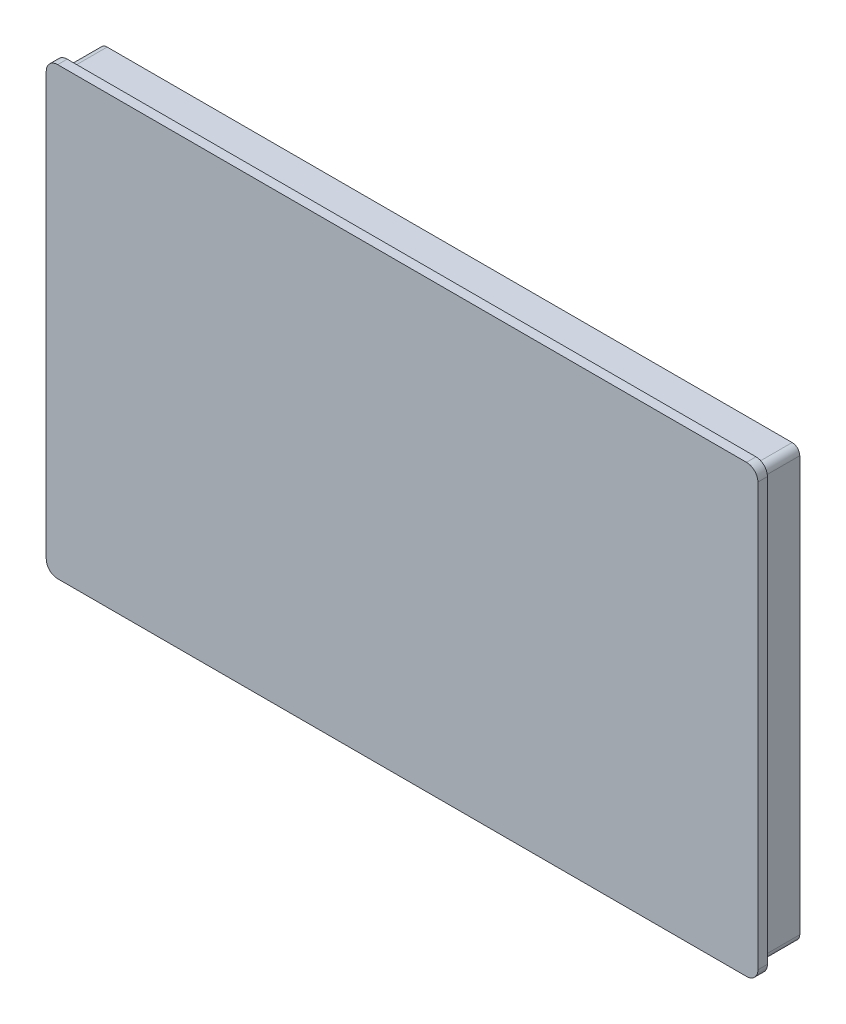
ISO-10303-21;
HEADER;
FILE_DESCRIPTION(('STEP AP214'),'2;1');
FILE_NAME('part.step','',(''),(''),'','','');
FILE_SCHEMA(('AUTOMOTIVE_DESIGN { 1 0 10303 214 1 1 1 1 }'));
ENDSEC;
DATA;
#1=APPLICATION_CONTEXT('core data for automotive mechanical design processes');
#2=APPLICATION_PROTOCOL_DEFINITION('international standard','automotive_design',2000,#1);
#3=PRODUCT_CONTEXT('',#1,'mechanical');
#4=PRODUCT('Part','Part','',(#3));
#5=PRODUCT_RELATED_PRODUCT_CATEGORY('part','',(#4));
#6=PRODUCT_DEFINITION_FORMATION('','',#4);
#7=PRODUCT_DEFINITION_CONTEXT('part definition',#1,'design');
#8=PRODUCT_DEFINITION('design','',#6,#7);
#9=PRODUCT_DEFINITION_SHAPE('','',#8);
#10=(LENGTH_UNIT() NAMED_UNIT(*) SI_UNIT(.MILLI.,.METRE.));
#11=(NAMED_UNIT(*) PLANE_ANGLE_UNIT() SI_UNIT($,.RADIAN.));
#12=(NAMED_UNIT(*) SI_UNIT($,.STERADIAN.) SOLID_ANGLE_UNIT());
#13=UNCERTAINTY_MEASURE_WITH_UNIT(LENGTH_MEASURE(1.E-05),#10,'distance_accuracy_value','');
#14=(GEOMETRIC_REPRESENTATION_CONTEXT(3) GLOBAL_UNCERTAINTY_ASSIGNED_CONTEXT((#13)) GLOBAL_UNIT_ASSIGNED_CONTEXT((#10,
#11,#12)) REPRESENTATION_CONTEXT('',''));
#15=CARTESIAN_POINT('',(0.,0.,0.));
#16=DIRECTION('',(0.,0.,1.));
#17=DIRECTION('',(1.,0.,0.));
#18=AXIS2_PLACEMENT_3D('',#15,#16,#17);
#19=CARTESIAN_POINT('',(90.5,55.5,12.5));
#20=DIRECTION('',(0.,0.,-1.));
#21=DIRECTION('',(-1.,0.,0.));
#22=AXIS2_PLACEMENT_3D('',#19,#20,#21);
#23=CYLINDRICAL_SURFACE('',#22,3.);
#24=DIRECTION('',(0.,0.,-1.));
#25=VECTOR('',#24,1.);
#26=CARTESIAN_POINT('',(90.5,58.5,12.5));
#27=LINE('',#26,#25);
#28=CARTESIAN_POINT('',(90.5,58.5,12.5));
#29=VERTEX_POINT('',#28);
#30=CARTESIAN_POINT('',(90.5,58.5,10.));
#31=VERTEX_POINT('',#30);
#32=EDGE_CURVE('E249',#29,#31,#27,.T.);
#33=ORIENTED_EDGE('',*,*,#32,.F.);
#34=CARTESIAN_POINT('',(90.5,55.5,12.5));
#35=DIRECTION('',(0.,0.,1.));
#36=DIRECTION('',(1.,0.,0.));
#37=AXIS2_PLACEMENT_3D('',#34,#35,#36);
#38=CIRCLE('',#37,3.);
#39=CARTESIAN_POINT('',(93.5,55.5,12.5));
#40=VERTEX_POINT('',#39);
#41=EDGE_CURVE('E40',#40,#29,#38,.T.);
#42=ORIENTED_EDGE('',*,*,#41,.F.);
#43=DIRECTION('',(0.,0.,-1.));
#44=VECTOR('',#43,1.);
#45=CARTESIAN_POINT('',(93.5,55.5,12.5));
#46=LINE('',#45,#44);
#47=CARTESIAN_POINT('',(93.5,55.5,10.));
#48=VERTEX_POINT('',#47);
#49=EDGE_CURVE('E252',#48,#40,#46,.F.);
#50=ORIENTED_EDGE('',*,*,#49,.F.);
#51=CARTESIAN_POINT('',(90.5,55.5,10.));
#52=DIRECTION('',(0.,0.,1.));
#53=DIRECTION('',(1.,0.,0.));
#54=AXIS2_PLACEMENT_3D('',#51,#52,#53);
#55=CIRCLE('',#54,3.);
#56=EDGE_CURVE('E11',#31,#48,#55,.F.);
#57=ORIENTED_EDGE('',*,*,#56,.F.);
#58=EDGE_LOOP('',(#33,#42,#50,#57));
#59=FACE_BOUND('',#58,.T.);
#60=ADVANCED_FACE('F33',(#59),#23,.T.);
#61=CARTESIAN_POINT('',(90.5,-55.5,12.5));
#62=DIRECTION('',(0.,0.,1.));
#63=DIRECTION('',(1.,0.,0.));
#64=AXIS2_PLACEMENT_3D('',#61,#62,#63);
#65=CYLINDRICAL_SURFACE('',#64,3.);
#66=DIRECTION('',(0.,0.,1.));
#67=VECTOR('',#66,1.);
#68=CARTESIAN_POINT('',(90.5,-58.5,12.5));
#69=LINE('',#68,#67);
#70=CARTESIAN_POINT('',(90.5,-58.5,10.));
#71=VERTEX_POINT('',#70);
#72=CARTESIAN_POINT('',(90.5,-58.5,12.5));
#73=VERTEX_POINT('',#72);
#74=EDGE_CURVE('E239',#71,#73,#69,.T.);
#75=ORIENTED_EDGE('',*,*,#74,.F.);
#76=CARTESIAN_POINT('',(90.5,-55.5,10.));
#77=DIRECTION('',(0.,0.,1.));
#78=DIRECTION('',(1.,0.,0.));
#79=AXIS2_PLACEMENT_3D('',#76,#77,#78);
#80=CIRCLE('',#79,3.);
#81=CARTESIAN_POINT('',(93.5,-55.5,10.));
#82=VERTEX_POINT('',#81);
#83=EDGE_CURVE('E245',#82,#71,#80,.F.);
#84=ORIENTED_EDGE('',*,*,#83,.F.);
#85=DIRECTION('',(0.,0.,1.));
#86=VECTOR('',#85,1.);
#87=CARTESIAN_POINT('',(93.5,-55.5,12.5));
#88=LINE('',#87,#86);
#89=CARTESIAN_POINT('',(93.5,-55.5,12.5));
#90=VERTEX_POINT('',#89);
#91=EDGE_CURVE('E242',#90,#82,#88,.F.);
#92=ORIENTED_EDGE('',*,*,#91,.F.);
#93=CARTESIAN_POINT('',(90.5,-55.5,12.5));
#94=DIRECTION('',(0.,0.,1.));
#95=DIRECTION('',(1.,0.,0.));
#96=AXIS2_PLACEMENT_3D('',#93,#94,#95);
#97=CIRCLE('',#96,3.);
#98=EDGE_CURVE('E247',#73,#90,#97,.T.);
#99=ORIENTED_EDGE('',*,*,#98,.F.);
#100=EDGE_LOOP('',(#75,#84,#92,#99));
#101=FACE_BOUND('',#100,.T.);
#102=ADVANCED_FACE('F312',(#101),#65,.T.);
#103=CARTESIAN_POINT('',(-90.5,-55.5,12.5));
#104=DIRECTION('',(0.,0.,1.));
#105=DIRECTION('',(1.,0.,0.));
#106=AXIS2_PLACEMENT_3D('',#103,#104,#105);
#107=CYLINDRICAL_SURFACE('',#106,3.);
#108=DIRECTION('',(0.,0.,1.));
#109=VECTOR('',#108,1.);
#110=CARTESIAN_POINT('',(-93.5,-55.5,12.5));
#111=LINE('',#110,#109);
#112=CARTESIAN_POINT('',(-93.5,-55.5,10.));
#113=VERTEX_POINT('',#112);
#114=CARTESIAN_POINT('',(-93.5,-55.5,12.5));
#115=VERTEX_POINT('',#114);
#116=EDGE_CURVE('E229',#113,#115,#111,.T.);
#117=ORIENTED_EDGE('',*,*,#116,.F.);
#118=CARTESIAN_POINT('',(-90.5,-55.5,10.));
#119=DIRECTION('',(0.,0.,1.));
#120=DIRECTION('',(1.,0.,0.));
#121=AXIS2_PLACEMENT_3D('',#118,#119,#120);
#122=CIRCLE('',#121,3.);
#123=CARTESIAN_POINT('',(-90.5,-58.5,10.));
#124=VERTEX_POINT('',#123);
#125=EDGE_CURVE('E235',#124,#113,#122,.F.);
#126=ORIENTED_EDGE('',*,*,#125,.F.);
#127=DIRECTION('',(0.,0.,1.));
#128=VECTOR('',#127,1.);
#129=CARTESIAN_POINT('',(-90.5,-58.5,12.5));
#130=LINE('',#129,#128);
#131=CARTESIAN_POINT('',(-90.5,-58.5,12.5));
#132=VERTEX_POINT('',#131);
#133=EDGE_CURVE('E232',#132,#124,#130,.F.);
#134=ORIENTED_EDGE('',*,*,#133,.F.);
#135=CARTESIAN_POINT('',(-90.5,-55.5,12.5));
#136=DIRECTION('',(0.,0.,1.));
#137=DIRECTION('',(1.,0.,0.));
#138=AXIS2_PLACEMENT_3D('',#135,#136,#137);
#139=CIRCLE('',#138,3.);
#140=EDGE_CURVE('E237',#115,#132,#139,.T.);
#141=ORIENTED_EDGE('',*,*,#140,.F.);
#142=EDGE_LOOP('',(#117,#126,#134,#141));
#143=FACE_BOUND('',#142,.T.);
#144=ADVANCED_FACE('F316',(#143),#107,.T.);
#145=CARTESIAN_POINT('',(-90.5,55.5,12.5));
#146=DIRECTION('',(0.,0.,1.));
#147=DIRECTION('',(1.,0.,0.));
#148=AXIS2_PLACEMENT_3D('',#145,#146,#147);
#149=CYLINDRICAL_SURFACE('',#148,3.);
#150=DIRECTION('',(0.,0.,1.));
#151=VECTOR('',#150,1.);
#152=CARTESIAN_POINT('',(-90.5,58.5,12.5));
#153=LINE('',#152,#151);
#154=CARTESIAN_POINT('',(-90.5,58.5,10.));
#155=VERTEX_POINT('',#154);
#156=CARTESIAN_POINT('',(-90.5,58.5,12.5));
#157=VERTEX_POINT('',#156);
#158=EDGE_CURVE('E218',#155,#157,#153,.T.);
#159=ORIENTED_EDGE('',*,*,#158,.F.);
#160=CARTESIAN_POINT('',(-90.5,55.5,10.));
#161=DIRECTION('',(0.,0.,1.));
#162=DIRECTION('',(1.,0.,0.));
#163=AXIS2_PLACEMENT_3D('',#160,#161,#162);
#164=CIRCLE('',#163,3.);
#165=CARTESIAN_POINT('',(-93.5,55.5,10.));
#166=VERTEX_POINT('',#165);
#167=EDGE_CURVE('E224',#166,#155,#164,.F.);
#168=ORIENTED_EDGE('',*,*,#167,.F.);
#169=DIRECTION('',(0.,0.,1.));
#170=VECTOR('',#169,1.);
#171=CARTESIAN_POINT('',(-93.5,55.5,12.5));
#172=LINE('',#171,#170);
#173=CARTESIAN_POINT('',(-93.5,55.5,12.5));
#174=VERTEX_POINT('',#173);
#175=EDGE_CURVE('E221',#174,#166,#172,.F.);
#176=ORIENTED_EDGE('',*,*,#175,.F.);
#177=CARTESIAN_POINT('',(-90.5,55.5,12.5));
#178=DIRECTION('',(0.,0.,1.));
#179=DIRECTION('',(1.,0.,0.));
#180=AXIS2_PLACEMENT_3D('',#177,#178,#179);
#181=CIRCLE('',#180,3.);
#182=EDGE_CURVE('E227',#157,#174,#181,.T.);
#183=ORIENTED_EDGE('',*,*,#182,.F.);
#184=EDGE_LOOP('',(#159,#168,#176,#183));
#185=FACE_BOUND('',#184,.T.);
#186=ADVANCED_FACE('F321',(#185),#149,.T.);
#187=CARTESIAN_POINT('',(90.,54.5,10.));
#188=DIRECTION('',(0.,0.,1.));
#189=DIRECTION('',(1.,0.,0.));
#190=AXIS2_PLACEMENT_3D('',#187,#188,#189);
#191=CYLINDRICAL_SURFACE('',#190,2.);
#192=DIRECTION('',(0.,0.,1.));
#193=VECTOR('',#192,1.);
#194=CARTESIAN_POINT('',(92.,54.5,10.));
#195=LINE('',#194,#193);
#196=CARTESIAN_POINT('',(92.,54.5,0.));
#197=VERTEX_POINT('',#196);
#198=CARTESIAN_POINT('',(92.,54.5,10.));
#199=VERTEX_POINT('',#198);
#200=EDGE_CURVE('E210',#197,#199,#195,.T.);
#201=ORIENTED_EDGE('',*,*,#200,.F.);
#202=CARTESIAN_POINT('',(90.,54.5,0.));
#203=DIRECTION('',(0.,0.,1.));
#204=DIRECTION('',(1.,0.,0.));
#205=AXIS2_PLACEMENT_3D('',#202,#203,#204);
#206=CIRCLE('',#205,2.);
#207=CARTESIAN_POINT('',(90.,56.5,0.));
#208=VERTEX_POINT('',#207);
#209=EDGE_CURVE('E215',#208,#197,#206,.F.);
#210=ORIENTED_EDGE('',*,*,#209,.F.);
#211=DIRECTION('',(0.,0.,1.));
#212=VECTOR('',#211,1.);
#213=CARTESIAN_POINT('',(90.,56.5,10.));
#214=LINE('',#213,#212);
#215=CARTESIAN_POINT('',(90.,56.5,10.));
#216=VERTEX_POINT('',#215);
#217=EDGE_CURVE('E213',#216,#208,#214,.F.);
#218=ORIENTED_EDGE('',*,*,#217,.F.);
#219=CARTESIAN_POINT('',(90.,54.5,10.));
#220=DIRECTION('',(0.,0.,1.));
#221=DIRECTION('',(1.,0.,0.));
#222=AXIS2_PLACEMENT_3D('',#219,#220,#221);
#223=CIRCLE('',#222,2.);
#224=EDGE_CURVE('E169',#199,#216,#223,.T.);
#225=ORIENTED_EDGE('',*,*,#224,.F.);
#226=EDGE_LOOP('',(#201,#210,#218,#225));
#227=FACE_BOUND('',#226,.T.);
#228=ADVANCED_FACE('F294',(#227),#191,.T.);
#229=CARTESIAN_POINT('',(90.,-54.5,10.));
#230=DIRECTION('',(0.,0.,1.));
#231=DIRECTION('',(1.,0.,0.));
#232=AXIS2_PLACEMENT_3D('',#229,#230,#231);
#233=CYLINDRICAL_SURFACE('',#232,2.);
#234=DIRECTION('',(0.,0.,1.));
#235=VECTOR('',#234,1.);
#236=CARTESIAN_POINT('',(90.,-56.5,10.));
#237=LINE('',#236,#235);
#238=CARTESIAN_POINT('',(90.,-56.5,0.));
#239=VERTEX_POINT('',#238);
#240=CARTESIAN_POINT('',(90.,-56.5,10.));
#241=VERTEX_POINT('',#240);
#242=EDGE_CURVE('E199',#239,#241,#237,.T.);
#243=ORIENTED_EDGE('',*,*,#242,.F.);
#244=CARTESIAN_POINT('',(90.,-54.5,0.));
#245=DIRECTION('',(0.,0.,1.));
#246=DIRECTION('',(1.,0.,0.));
#247=AXIS2_PLACEMENT_3D('',#244,#245,#246);
#248=CIRCLE('',#247,2.);
#249=CARTESIAN_POINT('',(92.,-54.5,0.));
#250=VERTEX_POINT('',#249);
#251=EDGE_CURVE('E205',#250,#239,#248,.F.);
#252=ORIENTED_EDGE('',*,*,#251,.F.);
#253=DIRECTION('',(0.,0.,1.));
#254=VECTOR('',#253,1.);
#255=CARTESIAN_POINT('',(92.,-54.5,10.));
#256=LINE('',#255,#254);
#257=CARTESIAN_POINT('',(92.,-54.5,10.));
#258=VERTEX_POINT('',#257);
#259=EDGE_CURVE('E202',#258,#250,#256,.F.);
#260=ORIENTED_EDGE('',*,*,#259,.F.);
#261=CARTESIAN_POINT('',(90.,-54.5,10.));
#262=DIRECTION('',(0.,0.,1.));
#263=DIRECTION('',(1.,0.,0.));
#264=AXIS2_PLACEMENT_3D('',#261,#262,#263);
#265=CIRCLE('',#264,2.);
#266=EDGE_CURVE('E207',#241,#258,#265,.T.);
#267=ORIENTED_EDGE('',*,*,#266,.F.);
#268=EDGE_LOOP('',(#243,#252,#260,#267));
#269=FACE_BOUND('',#268,.T.);
#270=ADVANCED_FACE('F287',(#269),#233,.T.);
#271=CARTESIAN_POINT('',(-90.,-54.5,10.));
#272=DIRECTION('',(0.,0.,1.));
#273=DIRECTION('',(1.,0.,0.));
#274=AXIS2_PLACEMENT_3D('',#271,#272,#273);
#275=CYLINDRICAL_SURFACE('',#274,2.);
#276=DIRECTION('',(0.,0.,1.));
#277=VECTOR('',#276,1.);
#278=CARTESIAN_POINT('',(-92.,-54.5,10.));
#279=LINE('',#278,#277);
#280=CARTESIAN_POINT('',(-92.,-54.5,0.));
#281=VERTEX_POINT('',#280);
#282=CARTESIAN_POINT('',(-92.,-54.5,10.));
#283=VERTEX_POINT('',#282);
#284=EDGE_CURVE('E163',#281,#283,#279,.T.);
#285=ORIENTED_EDGE('',*,*,#284,.F.);
#286=CARTESIAN_POINT('',(-90.,-54.5,0.));
#287=DIRECTION('',(0.,0.,1.));
#288=DIRECTION('',(1.,0.,0.));
#289=AXIS2_PLACEMENT_3D('',#286,#287,#288);
#290=CIRCLE('',#289,2.);
#291=CARTESIAN_POINT('',(-90.,-56.5,0.));
#292=VERTEX_POINT('',#291);
#293=EDGE_CURVE('E195',#292,#281,#290,.F.);
#294=ORIENTED_EDGE('',*,*,#293,.F.);
#295=DIRECTION('',(0.,0.,1.));
#296=VECTOR('',#295,1.);
#297=CARTESIAN_POINT('',(-90.,-56.5,10.));
#298=LINE('',#297,#296);
#299=CARTESIAN_POINT('',(-90.,-56.5,10.));
#300=VERTEX_POINT('',#299);
#301=EDGE_CURVE('E192',#300,#292,#298,.F.);
#302=ORIENTED_EDGE('',*,*,#301,.F.);
#303=CARTESIAN_POINT('',(-90.,-54.5,10.));
#304=DIRECTION('',(0.,0.,1.));
#305=DIRECTION('',(1.,0.,0.));
#306=AXIS2_PLACEMENT_3D('',#303,#304,#305);
#307=CIRCLE('',#306,2.);
#308=EDGE_CURVE('E197',#283,#300,#307,.T.);
#309=ORIENTED_EDGE('',*,*,#308,.F.);
#310=EDGE_LOOP('',(#285,#294,#302,#309));
#311=FACE_BOUND('',#310,.T.);
#312=ADVANCED_FACE('F302',(#311),#275,.T.);
#313=CARTESIAN_POINT('',(-90.,54.5,10.));
#314=DIRECTION('',(0.,0.,1.));
#315=DIRECTION('',(1.,0.,0.));
#316=AXIS2_PLACEMENT_3D('',#313,#314,#315);
#317=CYLINDRICAL_SURFACE('',#316,2.);
#318=DIRECTION('',(0.,0.,1.));
#319=VECTOR('',#318,1.);
#320=CARTESIAN_POINT('',(-90.,56.5,10.));
#321=LINE('',#320,#319);
#322=CARTESIAN_POINT('',(-90.,56.5,0.));
#323=VERTEX_POINT('',#322);
#324=CARTESIAN_POINT('',(-90.,56.5,10.));
#325=VERTEX_POINT('',#324);
#326=EDGE_CURVE('E143',#323,#325,#321,.T.);
#327=ORIENTED_EDGE('',*,*,#326,.F.);
#328=CARTESIAN_POINT('',(-90.,54.5,0.));
#329=DIRECTION('',(0.,0.,1.));
#330=DIRECTION('',(1.,0.,0.));
#331=AXIS2_PLACEMENT_3D('',#328,#329,#330);
#332=CIRCLE('',#331,2.);
#333=CARTESIAN_POINT('',(-92.,54.5,0.));
#334=VERTEX_POINT('',#333);
#335=EDGE_CURVE('E164',#334,#323,#332,.F.);
#336=ORIENTED_EDGE('',*,*,#335,.F.);
#337=DIRECTION('',(0.,0.,1.));
#338=VECTOR('',#337,1.);
#339=CARTESIAN_POINT('',(-92.,54.5,10.));
#340=LINE('',#339,#338);
#341=CARTESIAN_POINT('',(-92.,54.5,10.));
#342=VERTEX_POINT('',#341);
#343=EDGE_CURVE('E154',#342,#334,#340,.F.);
#344=ORIENTED_EDGE('',*,*,#343,.F.);
#345=CARTESIAN_POINT('',(-90.,54.5,10.));
#346=DIRECTION('',(0.,0.,1.));
#347=DIRECTION('',(1.,0.,0.));
#348=AXIS2_PLACEMENT_3D('',#345,#346,#347);
#349=CIRCLE('',#348,2.);
#350=EDGE_CURVE('E157',#325,#342,#349,.T.);
#351=ORIENTED_EDGE('',*,*,#350,.F.);
#352=EDGE_LOOP('',(#327,#336,#344,#351));
#353=FACE_BOUND('',#352,.T.);
#354=ADVANCED_FACE('F158',(#353),#317,.T.);
#355=CARTESIAN_POINT('',(-92.,-56.5,10.));
#356=DIRECTION('',(1.,0.,0.));
#357=DIRECTION('',(0.,0.,-1.));
#358=AXIS2_PLACEMENT_3D('',#355,#356,#357);
#359=PLANE('',#358);
#360=DIRECTION('',(0.,-1.,0.));
#361=VECTOR('',#360,1.);
#362=CARTESIAN_POINT('',(-92.,-56.5,0.));
#363=LINE('',#362,#361);
#364=EDGE_CURVE('E176',#334,#281,#363,.T.);
#365=ORIENTED_EDGE('',*,*,#364,.T.);
#366=ORIENTED_EDGE('',*,*,#284,.T.);
#367=DIRECTION('',(0.,-1.,0.));
#368=VECTOR('',#367,1.);
#369=CARTESIAN_POINT('',(-92.,-56.5,10.));
#370=LINE('',#369,#368);
#371=EDGE_CURVE('E186',#342,#283,#370,.T.);
#372=ORIENTED_EDGE('',*,*,#371,.F.);
#373=ORIENTED_EDGE('',*,*,#343,.T.);
#374=EDGE_LOOP('',(#365,#366,#372,#373));
#375=FACE_BOUND('',#374,.T.);
#376=ADVANCED_FACE('F299',(#375),#359,.F.);
#377=CARTESIAN_POINT('',(92.,-56.5,10.));
#378=DIRECTION('',(0.,1.,0.));
#379=DIRECTION('',(-1.,0.,0.));
#380=AXIS2_PLACEMENT_3D('',#377,#378,#379);
#381=PLANE('',#380);
#382=DIRECTION('',(1.,0.,0.));
#383=VECTOR('',#382,1.);
#384=CARTESIAN_POINT('',(92.,-56.5,0.));
#385=LINE('',#384,#383);
#386=EDGE_CURVE('E179',#292,#239,#385,.T.);
#387=ORIENTED_EDGE('',*,*,#386,.T.);
#388=ORIENTED_EDGE('',*,*,#242,.T.);
#389=DIRECTION('',(1.,0.,0.));
#390=VECTOR('',#389,1.);
#391=CARTESIAN_POINT('',(92.,-56.5,10.));
#392=LINE('',#391,#390);
#393=EDGE_CURVE('E172',#300,#241,#392,.T.);
#394=ORIENTED_EDGE('',*,*,#393,.F.);
#395=ORIENTED_EDGE('',*,*,#301,.T.);
#396=EDGE_LOOP('',(#387,#388,#394,#395));
#397=FACE_BOUND('',#396,.T.);
#398=ADVANCED_FACE('F283',(#397),#381,.F.);
#399=CARTESIAN_POINT('',(92.,-56.5,10.));
#400=DIRECTION('',(-1.,0.,0.));
#401=DIRECTION('',(0.,0.,1.));
#402=AXIS2_PLACEMENT_3D('',#399,#400,#401);
#403=PLANE('',#402);
#404=DIRECTION('',(0.,1.,0.));
#405=VECTOR('',#404,1.);
#406=CARTESIAN_POINT('',(92.,-56.5,0.));
#407=LINE('',#406,#405);
#408=EDGE_CURVE('E183',#250,#197,#407,.T.);
#409=ORIENTED_EDGE('',*,*,#408,.T.);
#410=ORIENTED_EDGE('',*,*,#200,.T.);
#411=DIRECTION('',(0.,1.,0.));
#412=VECTOR('',#411,1.);
#413=CARTESIAN_POINT('',(92.,-56.5,10.));
#414=LINE('',#413,#412);
#415=EDGE_CURVE('E170',#258,#199,#414,.T.);
#416=ORIENTED_EDGE('',*,*,#415,.F.);
#417=ORIENTED_EDGE('',*,*,#259,.T.);
#418=EDGE_LOOP('',(#409,#410,#416,#417));
#419=FACE_BOUND('',#418,.T.);
#420=ADVANCED_FACE('F291',(#419),#403,.F.);
#421=CARTESIAN_POINT('',(92.,56.5,10.));
#422=DIRECTION('',(0.,-1.,0.));
#423=DIRECTION('',(1.,0.,0.));
#424=AXIS2_PLACEMENT_3D('',#421,#422,#423);
#425=PLANE('',#424);
#426=DIRECTION('',(-1.,0.,0.));
#427=VECTOR('',#426,1.);
#428=CARTESIAN_POINT('',(92.,56.5,10.));
#429=LINE('',#428,#427);
#430=EDGE_CURVE('E148',#216,#325,#429,.T.);
#431=ORIENTED_EDGE('',*,*,#430,.F.);
#432=ORIENTED_EDGE('',*,*,#217,.T.);
#433=DIRECTION('',(-1.,0.,0.));
#434=VECTOR('',#433,1.);
#435=CARTESIAN_POINT('',(92.,56.5,0.));
#436=LINE('',#435,#434);
#437=EDGE_CURVE('E151',#208,#323,#436,.T.);
#438=ORIENTED_EDGE('',*,*,#437,.T.);
#439=ORIENTED_EDGE('',*,*,#326,.T.);
#440=EDGE_LOOP('',(#431,#432,#438,#439));
#441=FACE_BOUND('',#440,.T.);
#442=ADVANCED_FACE('F145',(#441),#425,.F.);
#443=CARTESIAN_POINT('',(0.,0.,0.));
#444=DIRECTION('',(0.,0.,1.));
#445=DIRECTION('',(1.,0.,0.));
#446=AXIS2_PLACEMENT_3D('',#443,#444,#445);
#447=PLANE('',#446);
#448=ORIENTED_EDGE('',*,*,#437,.F.);
#449=ORIENTED_EDGE('',*,*,#209,.T.);
#450=ORIENTED_EDGE('',*,*,#408,.F.);
#451=ORIENTED_EDGE('',*,*,#251,.T.);
#452=ORIENTED_EDGE('',*,*,#386,.F.);
#453=ORIENTED_EDGE('',*,*,#293,.T.);
#454=ORIENTED_EDGE('',*,*,#364,.F.);
#455=ORIENTED_EDGE('',*,*,#335,.T.);
#456=EDGE_LOOP('',(#448,#449,#450,#451,#452,#453,#454,#455));
#457=FACE_BOUND('',#456,.T.);
#458=ADVANCED_FACE('F296',(#457),#447,.F.);
#459=CARTESIAN_POINT('',(0.,0.,10.));
#460=DIRECTION('',(0.,0.,1.));
#461=DIRECTION('',(1.,0.,0.));
#462=AXIS2_PLACEMENT_3D('',#459,#460,#461);
#463=PLANE('',#462);
#464=DIRECTION('',(-1.,0.,0.));
#465=VECTOR('',#464,1.);
#466=CARTESIAN_POINT('',(93.5,58.5,10.));
#467=LINE('',#466,#465);
#468=EDGE_CURVE('E277',#31,#155,#467,.T.);
#469=ORIENTED_EDGE('',*,*,#468,.F.);
#470=ORIENTED_EDGE('',*,*,#56,.T.);
#471=DIRECTION('',(0.,1.,0.));
#472=VECTOR('',#471,1.);
#473=CARTESIAN_POINT('',(93.5,-58.5,10.));
#474=LINE('',#473,#472);
#475=EDGE_CURVE('E274',#82,#48,#474,.T.);
#476=ORIENTED_EDGE('',*,*,#475,.F.);
#477=ORIENTED_EDGE('',*,*,#83,.T.);
#478=DIRECTION('',(1.,0.,0.));
#479=VECTOR('',#478,1.);
#480=CARTESIAN_POINT('',(93.5,-58.5,10.));
#481=LINE('',#480,#479);
#482=EDGE_CURVE('E271',#124,#71,#481,.T.);
#483=ORIENTED_EDGE('',*,*,#482,.F.);
#484=ORIENTED_EDGE('',*,*,#125,.T.);
#485=DIRECTION('',(0.,-1.,0.));
#486=VECTOR('',#485,1.);
#487=CARTESIAN_POINT('',(-93.5,-58.5,10.));
#488=LINE('',#487,#486);
#489=EDGE_CURVE('E268',#166,#113,#488,.T.);
#490=ORIENTED_EDGE('',*,*,#489,.F.);
#491=ORIENTED_EDGE('',*,*,#167,.T.);
#492=EDGE_LOOP('',(#469,#470,#476,#477,#483,#484,#490,#491));
#493=FACE_BOUND('',#492,.T.);
#494=ORIENTED_EDGE('',*,*,#308,.T.);
#495=ORIENTED_EDGE('',*,*,#393,.T.);
#496=ORIENTED_EDGE('',*,*,#266,.T.);
#497=ORIENTED_EDGE('',*,*,#415,.T.);
#498=ORIENTED_EDGE('',*,*,#224,.T.);
#499=ORIENTED_EDGE('',*,*,#430,.T.);
#500=ORIENTED_EDGE('',*,*,#350,.T.);
#501=ORIENTED_EDGE('',*,*,#371,.T.);
#502=EDGE_LOOP('',(#494,#495,#496,#497,#498,#499,#500,#501));
#503=FACE_BOUND('',#502,.T.);
#504=ADVANCED_FACE('F167',(#493,#503),#463,.F.);
#505=CARTESIAN_POINT('',(-93.5,-58.5,12.5));
#506=DIRECTION('',(1.,0.,0.));
#507=DIRECTION('',(0.,0.,-1.));
#508=AXIS2_PLACEMENT_3D('',#505,#506,#507);
#509=PLANE('',#508);
#510=ORIENTED_EDGE('',*,*,#489,.T.);
#511=ORIENTED_EDGE('',*,*,#116,.T.);
#512=DIRECTION('',(0.,-1.,0.));
#513=VECTOR('',#512,1.);
#514=CARTESIAN_POINT('',(-93.5,-58.5,12.5));
#515=LINE('',#514,#513);
#516=EDGE_CURVE('E279',#174,#115,#515,.T.);
#517=ORIENTED_EDGE('',*,*,#516,.F.);
#518=ORIENTED_EDGE('',*,*,#175,.T.);
#519=EDGE_LOOP('',(#510,#511,#517,#518));
#520=FACE_BOUND('',#519,.T.);
#521=ADVANCED_FACE('F400',(#520),#509,.F.);
#522=CARTESIAN_POINT('',(93.5,-58.5,12.5));
#523=DIRECTION('',(0.,1.,0.));
#524=DIRECTION('',(-1.,0.,0.));
#525=AXIS2_PLACEMENT_3D('',#522,#523,#524);
#526=PLANE('',#525);
#527=ORIENTED_EDGE('',*,*,#482,.T.);
#528=ORIENTED_EDGE('',*,*,#74,.T.);
#529=DIRECTION('',(1.,0.,0.));
#530=VECTOR('',#529,1.);
#531=CARTESIAN_POINT('',(93.5,-58.5,12.5));
#532=LINE('',#531,#530);
#533=EDGE_CURVE('E264',#132,#73,#532,.T.);
#534=ORIENTED_EDGE('',*,*,#533,.F.);
#535=ORIENTED_EDGE('',*,*,#133,.T.);
#536=EDGE_LOOP('',(#527,#528,#534,#535));
#537=FACE_BOUND('',#536,.T.);
#538=ADVANCED_FACE('F404',(#537),#526,.F.);
#539=CARTESIAN_POINT('',(93.5,-58.5,12.5));
#540=DIRECTION('',(-1.,0.,0.));
#541=DIRECTION('',(0.,0.,1.));
#542=AXIS2_PLACEMENT_3D('',#539,#540,#541);
#543=PLANE('',#542);
#544=ORIENTED_EDGE('',*,*,#475,.T.);
#545=ORIENTED_EDGE('',*,*,#49,.T.);
#546=DIRECTION('',(0.,1.,0.));
#547=VECTOR('',#546,1.);
#548=CARTESIAN_POINT('',(93.5,-58.5,12.5));
#549=LINE('',#548,#547);
#550=EDGE_CURVE('E259',#90,#40,#549,.T.);
#551=ORIENTED_EDGE('',*,*,#550,.F.);
#552=ORIENTED_EDGE('',*,*,#91,.T.);
#553=EDGE_LOOP('',(#544,#545,#551,#552));
#554=FACE_BOUND('',#553,.T.);
#555=ADVANCED_FACE('F420',(#554),#543,.F.);
#556=CARTESIAN_POINT('',(93.5,58.5,12.5));
#557=DIRECTION('',(0.,-1.,0.));
#558=DIRECTION('',(1.,0.,0.));
#559=AXIS2_PLACEMENT_3D('',#556,#557,#558);
#560=PLANE('',#559);
#561=DIRECTION('',(-1.,0.,0.));
#562=VECTOR('',#561,1.);
#563=CARTESIAN_POINT('',(93.5,58.5,12.5));
#564=LINE('',#563,#562);
#565=EDGE_CURVE('E180',#29,#157,#564,.T.);
#566=ORIENTED_EDGE('',*,*,#565,.F.);
#567=ORIENTED_EDGE('',*,*,#32,.T.);
#568=ORIENTED_EDGE('',*,*,#468,.T.);
#569=ORIENTED_EDGE('',*,*,#158,.T.);
#570=EDGE_LOOP('',(#566,#567,#568,#569));
#571=FACE_BOUND('',#570,.T.);
#572=ADVANCED_FACE('F261',(#571),#560,.F.);
#573=CARTESIAN_POINT('',(0.,0.,12.5));
#574=DIRECTION('',(0.,0.,1.));
#575=DIRECTION('',(1.,0.,0.));
#576=AXIS2_PLACEMENT_3D('',#573,#574,#575);
#577=PLANE('',#576);
#578=ORIENTED_EDGE('',*,*,#550,.T.);
#579=ORIENTED_EDGE('',*,*,#41,.T.);
#580=ORIENTED_EDGE('',*,*,#565,.T.);
#581=ORIENTED_EDGE('',*,*,#182,.T.);
#582=ORIENTED_EDGE('',*,*,#516,.T.);
#583=ORIENTED_EDGE('',*,*,#140,.T.);
#584=ORIENTED_EDGE('',*,*,#533,.T.);
#585=ORIENTED_EDGE('',*,*,#98,.T.);
#586=EDGE_LOOP('',(#578,#579,#580,#581,#582,#583,#584,#585));
#587=FACE_BOUND('',#586,.T.);
#588=ADVANCED_FACE('F255',(#587),#577,.T.);
#589=CLOSED_SHELL('',(#60,#102,#144,#186,#228,#270,#312,#354,#376,#398,#420,#442,#458,#504,#521,
#538,#555,#572,#588));
#590=MANIFOLD_SOLID_BREP('B2',#589);
#591=ADVANCED_BREP_SHAPE_REPRESENTATION('',(#18,#590),#14);
#592=SHAPE_DEFINITION_REPRESENTATION(#9,#591);
ENDSEC;
END-ISO-10303-21;
